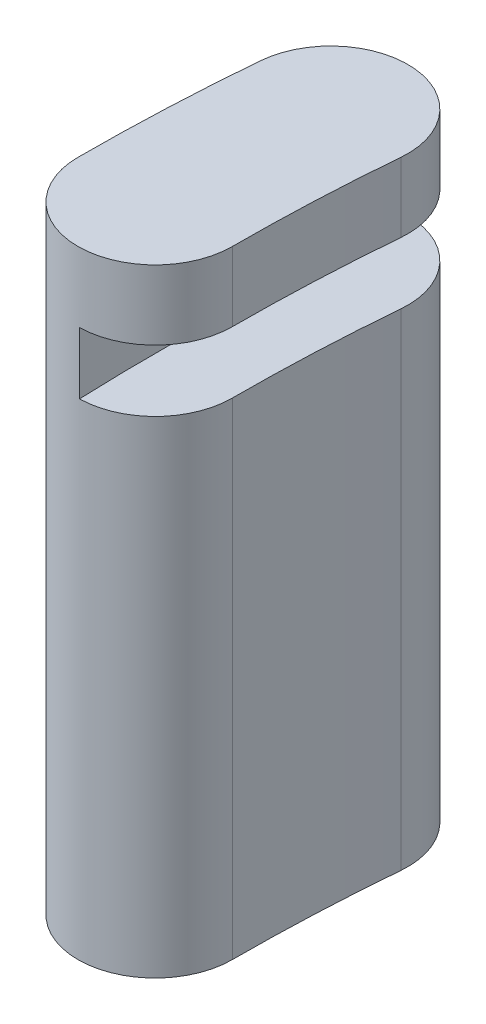
ISO-10303-21;
HEADER;
FILE_DESCRIPTION(('STEP AP214'),'2;1');
FILE_NAME('part.step','',(''),(''),'','','');
FILE_SCHEMA(('AUTOMOTIVE_DESIGN { 1 0 10303 214 1 1 1 1 }'));
ENDSEC;
DATA;
#1=APPLICATION_CONTEXT('core data for automotive mechanical design processes');
#2=APPLICATION_PROTOCOL_DEFINITION('international standard','automotive_design',2000,#1);
#3=PRODUCT_CONTEXT('',#1,'mechanical');
#4=PRODUCT('Part','Part','',(#3));
#5=PRODUCT_RELATED_PRODUCT_CATEGORY('part','',(#4));
#6=PRODUCT_DEFINITION_FORMATION('','',#4);
#7=PRODUCT_DEFINITION_CONTEXT('part definition',#1,'design');
#8=PRODUCT_DEFINITION('design','',#6,#7);
#9=PRODUCT_DEFINITION_SHAPE('','',#8);
#10=(LENGTH_UNIT() NAMED_UNIT(*) SI_UNIT(.MILLI.,.METRE.));
#11=(NAMED_UNIT(*) PLANE_ANGLE_UNIT() SI_UNIT($,.RADIAN.));
#12=(NAMED_UNIT(*) SI_UNIT($,.STERADIAN.) SOLID_ANGLE_UNIT());
#13=UNCERTAINTY_MEASURE_WITH_UNIT(LENGTH_MEASURE(1.E-05),#10,'distance_accuracy_value','');
#14=(GEOMETRIC_REPRESENTATION_CONTEXT(3) GLOBAL_UNCERTAINTY_ASSIGNED_CONTEXT((#13)) GLOBAL_UNIT_ASSIGNED_CONTEXT((#10,
#11,#12)) REPRESENTATION_CONTEXT('',''));
#15=CARTESIAN_POINT('',(0.,0.,0.));
#16=DIRECTION('',(0.,0.,1.));
#17=DIRECTION('',(1.,0.,0.));
#18=AXIS2_PLACEMENT_3D('',#15,#16,#17);
#19=CARTESIAN_POINT('',(-124.524337261468,40.,-10.8944678434573));
#20=DIRECTION('',(0.,-1.,0.));
#21=DIRECTION('',(0.,0.,-1.));
#22=AXIS2_PLACEMENT_3D('',#19,#20,#21);
#23=CYLINDRICAL_SURFACE('',#22,4.99999999999999);
#24=CARTESIAN_POINT('',(-124.524337261468,35.5,-10.8944678434573));
#25=DIRECTION('',(0.,-1.,0.));
#26=DIRECTION('',(0.,0.,-1.));
#27=AXIS2_PLACEMENT_3D('',#24,#25,#26);
#28=CIRCLE('',#27,5.);
#29=CARTESIAN_POINT('',(-123.989026242381,35.5,-15.8657294653038));
#30=VERTEX_POINT('',#29);
#31=CARTESIAN_POINT('',(-119.543363771009,35.5,-10.458689129719));
#32=VERTEX_POINT('',#31);
#33=EDGE_CURVE('E121',#30,#32,#28,.T.);
#34=ORIENTED_EDGE('',*,*,#33,.F.);
#35=DIRECTION('',(0.,-1.,0.));
#36=VECTOR('',#35,1.);
#37=CARTESIAN_POINT('',(-123.989026242381,35.5,-15.8657294653038));
#38=LINE('',#37,#36);
#39=CARTESIAN_POINT('',(-123.989026242381,31.5,-15.8657294653038));
#40=VERTEX_POINT('',#39);
#41=EDGE_CURVE('E108',#30,#40,#38,.T.);
#42=ORIENTED_EDGE('',*,*,#41,.T.);
#43=CARTESIAN_POINT('',(-124.524337261468,31.5,-10.8944678434573));
#44=DIRECTION('',(0.,-1.,0.));
#45=DIRECTION('',(0.,0.,-1.));
#46=AXIS2_PLACEMENT_3D('',#43,#44,#45);
#47=CIRCLE('',#46,5.);
#48=CARTESIAN_POINT('',(-119.543363771009,31.5,-10.458689129719));
#49=VERTEX_POINT('',#48);
#50=EDGE_CURVE('E134',#40,#49,#47,.T.);
#51=ORIENTED_EDGE('',*,*,#50,.T.);
#52=DIRECTION('',(0.,-1.,0.));
#53=VECTOR('',#52,1.);
#54=CARTESIAN_POINT('',(-119.543363771009,40.,-10.458689129719));
#55=LINE('',#54,#53);
#56=CARTESIAN_POINT('',(-119.543363771009,0.,-10.458689129719));
#57=VERTEX_POINT('',#56);
#58=EDGE_CURVE('E78',#49,#57,#55,.T.);
#59=ORIENTED_EDGE('',*,*,#58,.T.);
#60=CARTESIAN_POINT('',(-124.524337261468,0.,-10.8944678434573));
#61=DIRECTION('',(0.,1.,0.));
#62=DIRECTION('',(0.,0.,1.));
#63=AXIS2_PLACEMENT_3D('',#60,#61,#62);
#64=CIRCLE('',#63,4.99999999999999);
#65=CARTESIAN_POINT('',(-129.505310751927,0.,-11.3302465571956));
#66=VERTEX_POINT('',#65);
#67=EDGE_CURVE('E139',#57,#66,#64,.T.);
#68=ORIENTED_EDGE('',*,*,#67,.T.);
#69=DIRECTION('',(0.,-1.,0.));
#70=VECTOR('',#69,1.);
#71=CARTESIAN_POINT('',(-129.505310751927,40.,-11.3302465571956));
#72=LINE('',#71,#70);
#73=CARTESIAN_POINT('',(-129.505310751927,40.,-11.3302465571956));
#74=VERTEX_POINT('',#73);
#75=EDGE_CURVE('E11',#74,#66,#72,.T.);
#76=ORIENTED_EDGE('',*,*,#75,.F.);
#77=CARTESIAN_POINT('',(-124.524337261468,40.,-10.8944678434573));
#78=DIRECTION('',(0.,1.,0.));
#79=DIRECTION('',(0.,0.,1.));
#80=AXIS2_PLACEMENT_3D('',#77,#78,#79);
#81=CIRCLE('',#80,4.99999999999999);
#82=CARTESIAN_POINT('',(-119.543363771009,40.,-10.458689129719));
#83=VERTEX_POINT('',#82);
#84=EDGE_CURVE('E141',#83,#74,#81,.T.);
#85=ORIENTED_EDGE('',*,*,#84,.F.);
#86=EDGE_CURVE('E127',#83,#32,#55,.T.);
#87=ORIENTED_EDGE('',*,*,#86,.T.);
#88=EDGE_LOOP('',(#34,#42,#51,#59,#68,#76,#85,#87));
#89=FACE_BOUND('',#88,.T.);
#90=ADVANCED_FACE('F33',(#89),#23,.T.);
#91=CARTESIAN_POINT('',(-125.,40.,0.));
#92=DIRECTION('',(0.,-1.,0.));
#93=DIRECTION('',(0.,0.,-1.));
#94=AXIS2_PLACEMENT_3D('',#91,#92,#93);
#95=CYLINDRICAL_SURFACE('',#94,5.);
#96=CARTESIAN_POINT('',(-125.,35.5,0.));
#97=DIRECTION('',(0.,-1.,0.));
#98=DIRECTION('',(0.,0.,-1.));
#99=AXIS2_PLACEMENT_3D('',#96,#97,#98);
#100=CIRCLE('',#99,5.00000000000003);
#101=CARTESIAN_POINT('',(-124.9,35.5,4.99899989998003));
#102=VERTEX_POINT('',#101);
#103=CARTESIAN_POINT('',(-120.,35.5,0.));
#104=VERTEX_POINT('',#103);
#105=EDGE_CURVE('E117',#102,#104,#100,.F.);
#106=ORIENTED_EDGE('',*,*,#105,.T.);
#107=DIRECTION('',(0.,-1.,0.));
#108=VECTOR('',#107,1.);
#109=CARTESIAN_POINT('',(-120.,40.,0.));
#110=LINE('',#109,#108);
#111=CARTESIAN_POINT('',(-120.,40.,0.));
#112=VERTEX_POINT('',#111);
#113=EDGE_CURVE('E157',#112,#104,#110,.T.);
#114=ORIENTED_EDGE('',*,*,#113,.F.);
#115=CARTESIAN_POINT('',(-125.,40.,0.));
#116=DIRECTION('',(0.,1.,0.));
#117=DIRECTION('',(0.,0.,1.));
#118=AXIS2_PLACEMENT_3D('',#115,#116,#117);
#119=CIRCLE('',#118,5.);
#120=CARTESIAN_POINT('',(-130.,40.,0.));
#121=VERTEX_POINT('',#120);
#122=EDGE_CURVE('E145',#121,#112,#119,.T.);
#123=ORIENTED_EDGE('',*,*,#122,.F.);
#124=DIRECTION('',(0.,-1.,0.));
#125=VECTOR('',#124,1.);
#126=CARTESIAN_POINT('',(-130.,40.,0.));
#127=LINE('',#126,#125);
#128=CARTESIAN_POINT('',(-130.,0.,0.));
#129=VERTEX_POINT('',#128);
#130=EDGE_CURVE('E40',#121,#129,#127,.T.);
#131=ORIENTED_EDGE('',*,*,#130,.T.);
#132=CARTESIAN_POINT('',(-125.,0.,0.));
#133=DIRECTION('',(0.,1.,0.));
#134=DIRECTION('',(0.,0.,1.));
#135=AXIS2_PLACEMENT_3D('',#132,#133,#134);
#136=CIRCLE('',#135,5.);
#137=CARTESIAN_POINT('',(-120.,0.,0.));
#138=VERTEX_POINT('',#137);
#139=EDGE_CURVE('E151',#129,#138,#136,.T.);
#140=ORIENTED_EDGE('',*,*,#139,.T.);
#141=CARTESIAN_POINT('',(-120.,31.5,0.));
#142=VERTEX_POINT('',#141);
#143=EDGE_CURVE('E156',#142,#138,#110,.T.);
#144=ORIENTED_EDGE('',*,*,#143,.F.);
#145=CARTESIAN_POINT('',(-125.,31.5,0.));
#146=DIRECTION('',(0.,-1.,0.));
#147=DIRECTION('',(0.,0.,-1.));
#148=AXIS2_PLACEMENT_3D('',#145,#146,#147);
#149=CIRCLE('',#148,5.00000000000003);
#150=CARTESIAN_POINT('',(-124.9,31.5,4.99899989998003));
#151=VERTEX_POINT('',#150);
#152=EDGE_CURVE('E47',#151,#142,#149,.F.);
#153=ORIENTED_EDGE('',*,*,#152,.F.);
#154=DIRECTION('',(0.,-1.,0.));
#155=VECTOR('',#154,1.);
#156=CARTESIAN_POINT('',(-124.9,35.5,4.99899989998003));
#157=LINE('',#156,#155);
#158=EDGE_CURVE('E116',#102,#151,#157,.T.);
#159=ORIENTED_EDGE('',*,*,#158,.F.);
#160=EDGE_LOOP('',(#106,#114,#123,#131,#140,#144,#153,#159));
#161=FACE_BOUND('',#160,.T.);
#162=ADVANCED_FACE('F163',(#161),#95,.T.);
#163=CARTESIAN_POINT('',(0.,40.,0.));
#164=DIRECTION('',(0.,-1.,0.));
#165=DIRECTION('',(0.,0.,-1.));
#166=AXIS2_PLACEMENT_3D('',#163,#164,#165);
#167=CYLINDRICAL_SURFACE('',#166,120.);
#168=CARTESIAN_POINT('',(0.,35.5,0.));
#169=DIRECTION('',(0.,-1.,0.));
#170=DIRECTION('',(0.,0.,-1.));
#171=AXIS2_PLACEMENT_3D('',#168,#169,#170);
#172=CIRCLE('',#171,120.);
#173=EDGE_CURVE('E128',#32,#104,#172,.F.);
#174=ORIENTED_EDGE('',*,*,#173,.F.);
#175=ORIENTED_EDGE('',*,*,#86,.F.);
#176=CARTESIAN_POINT('',(0.,40.,0.));
#177=DIRECTION('',(0.,-1.,0.));
#178=DIRECTION('',(0.,0.,1.));
#179=AXIS2_PLACEMENT_3D('',#176,#177,#178);
#180=CIRCLE('',#179,120.);
#181=EDGE_CURVE('E56',#112,#83,#180,.T.);
#182=ORIENTED_EDGE('',*,*,#181,.F.);
#183=ORIENTED_EDGE('',*,*,#113,.T.);
#184=EDGE_LOOP('',(#174,#175,#182,#183));
#185=FACE_BOUND('',#184,.T.);
#186=ADVANCED_FACE('F184',(#185),#167,.F.);
#187=CARTESIAN_POINT('',(0.,40.,0.));
#188=DIRECTION('',(0.,-1.,0.));
#189=DIRECTION('',(0.,0.,-1.));
#190=AXIS2_PLACEMENT_3D('',#187,#188,#189);
#191=CYLINDRICAL_SURFACE('',#190,130.);
#192=CARTESIAN_POINT('',(0.,0.,0.));
#193=DIRECTION('',(0.,1.,0.));
#194=DIRECTION('',(0.,0.,1.));
#195=AXIS2_PLACEMENT_3D('',#192,#193,#194);
#196=CIRCLE('',#195,130.);
#197=EDGE_CURVE('E149',#66,#129,#196,.T.);
#198=ORIENTED_EDGE('',*,*,#197,.T.);
#199=ORIENTED_EDGE('',*,*,#130,.F.);
#200=CARTESIAN_POINT('',(0.,40.,0.));
#201=DIRECTION('',(0.,1.,0.));
#202=DIRECTION('',(0.,0.,1.));
#203=AXIS2_PLACEMENT_3D('',#200,#201,#202);
#204=CIRCLE('',#203,130.);
#205=EDGE_CURVE('E85',#74,#121,#204,.T.);
#206=ORIENTED_EDGE('',*,*,#205,.F.);
#207=ORIENTED_EDGE('',*,*,#75,.T.);
#208=EDGE_LOOP('',(#198,#199,#206,#207));
#209=FACE_BOUND('',#208,.T.);
#210=ADVANCED_FACE('F189',(#209),#191,.T.);
#211=ORIENTED_EDGE('',*,*,#58,.F.);
#212=CARTESIAN_POINT('',(0.,31.5,0.));
#213=DIRECTION('',(0.,-1.,0.));
#214=DIRECTION('',(0.,0.,-1.));
#215=AXIS2_PLACEMENT_3D('',#212,#213,#214);
#216=CIRCLE('',#215,120.);
#217=EDGE_CURVE('E136',#49,#142,#216,.F.);
#218=ORIENTED_EDGE('',*,*,#217,.T.);
#219=ORIENTED_EDGE('',*,*,#143,.T.);
#220=CARTESIAN_POINT('',(0.,0.,0.));
#221=DIRECTION('',(0.,-1.,0.));
#222=DIRECTION('',(0.,0.,1.));
#223=AXIS2_PLACEMENT_3D('',#220,#221,#222);
#224=CIRCLE('',#223,120.);
#225=EDGE_CURVE('E143',#138,#57,#224,.T.);
#226=ORIENTED_EDGE('',*,*,#225,.T.);
#227=EDGE_LOOP('',(#211,#218,#219,#226));
#228=FACE_BOUND('',#227,.T.);
#229=ADVANCED_FACE('F171',(#228),#167,.F.);
#230=CARTESIAN_POINT('',(-62.2621686307341,40.,-5.44723392172864));
#231=DIRECTION('',(0.,1.,0.));
#232=DIRECTION('',(0.,0.,1.));
#233=AXIS2_PLACEMENT_3D('',#230,#231,#232);
#234=PLANE('',#233);
#235=ORIENTED_EDGE('',*,*,#84,.T.);
#236=ORIENTED_EDGE('',*,*,#205,.T.);
#237=ORIENTED_EDGE('',*,*,#122,.T.);
#238=ORIENTED_EDGE('',*,*,#181,.T.);
#239=EDGE_LOOP('',(#235,#236,#237,#238));
#240=FACE_BOUND('',#239,.T.);
#241=ADVANCED_FACE('F197',(#240),#234,.T.);
#242=CARTESIAN_POINT('',(-62.2621686307341,0.,-5.44723392172864));
#243=DIRECTION('',(0.,1.,0.));
#244=DIRECTION('',(0.,0.,1.));
#245=AXIS2_PLACEMENT_3D('',#242,#243,#244);
#246=PLANE('',#245);
#247=ORIENTED_EDGE('',*,*,#67,.F.);
#248=ORIENTED_EDGE('',*,*,#225,.F.);
#249=ORIENTED_EDGE('',*,*,#139,.F.);
#250=ORIENTED_EDGE('',*,*,#197,.F.);
#251=EDGE_LOOP('',(#247,#248,#249,#250));
#252=FACE_BOUND('',#251,.T.);
#253=ADVANCED_FACE('F169',(#252),#246,.F.);
#254=CARTESIAN_POINT('',(0.,35.5,0.));
#255=DIRECTION('',(0.,-1.,0.));
#256=DIRECTION('',(0.,0.,-1.));
#257=AXIS2_PLACEMENT_3D('',#254,#255,#256);
#258=CYLINDRICAL_SURFACE('',#257,125.);
#259=CARTESIAN_POINT('',(0.,31.5,0.));
#260=DIRECTION('',(0.,-1.,0.));
#261=DIRECTION('',(0.,0.,-1.));
#262=AXIS2_PLACEMENT_3D('',#259,#260,#261);
#263=CIRCLE('',#262,125.);
#264=EDGE_CURVE('E113',#40,#151,#263,.F.);
#265=ORIENTED_EDGE('',*,*,#264,.F.);
#266=ORIENTED_EDGE('',*,*,#41,.F.);
#267=CARTESIAN_POINT('',(0.,35.5,0.));
#268=DIRECTION('',(0.,-1.,0.));
#269=DIRECTION('',(0.,0.,-1.));
#270=AXIS2_PLACEMENT_3D('',#267,#268,#269);
#271=CIRCLE('',#270,125.);
#272=EDGE_CURVE('E111',#30,#102,#271,.F.);
#273=ORIENTED_EDGE('',*,*,#272,.T.);
#274=ORIENTED_EDGE('',*,*,#158,.T.);
#275=EDGE_LOOP('',(#265,#266,#273,#274));
#276=FACE_BOUND('',#275,.T.);
#277=ADVANCED_FACE('F110',(#276),#258,.F.);
#278=CARTESIAN_POINT('',(0.,35.5,0.));
#279=DIRECTION('',(0.,-1.,0.));
#280=DIRECTION('',(0.,0.,-1.));
#281=AXIS2_PLACEMENT_3D('',#278,#279,#280);
#282=PLANE('',#281);
#283=ORIENTED_EDGE('',*,*,#272,.F.);
#284=ORIENTED_EDGE('',*,*,#33,.T.);
#285=ORIENTED_EDGE('',*,*,#173,.T.);
#286=ORIENTED_EDGE('',*,*,#105,.F.);
#287=EDGE_LOOP('',(#283,#284,#285,#286));
#288=FACE_BOUND('',#287,.T.);
#289=ADVANCED_FACE('F120',(#288),#282,.T.);
#290=CARTESIAN_POINT('',(0.,31.5,0.));
#291=DIRECTION('',(0.,-1.,0.));
#292=DIRECTION('',(0.,0.,-1.));
#293=AXIS2_PLACEMENT_3D('',#290,#291,#292);
#294=PLANE('',#293);
#295=ORIENTED_EDGE('',*,*,#264,.T.);
#296=ORIENTED_EDGE('',*,*,#152,.T.);
#297=ORIENTED_EDGE('',*,*,#217,.F.);
#298=ORIENTED_EDGE('',*,*,#50,.F.);
#299=EDGE_LOOP('',(#295,#296,#297,#298));
#300=FACE_BOUND('',#299,.T.);
#301=ADVANCED_FACE('F172',(#300),#294,.F.);
#302=CLOSED_SHELL('',(#90,#162,#186,#210,#229,#241,#253,#277,#289,#301));
#303=MANIFOLD_SOLID_BREP('B2',#302);
#304=ADVANCED_BREP_SHAPE_REPRESENTATION('',(#18,#303),#14);
#305=SHAPE_DEFINITION_REPRESENTATION(#9,#304);
ENDSEC;
END-ISO-10303-21;
